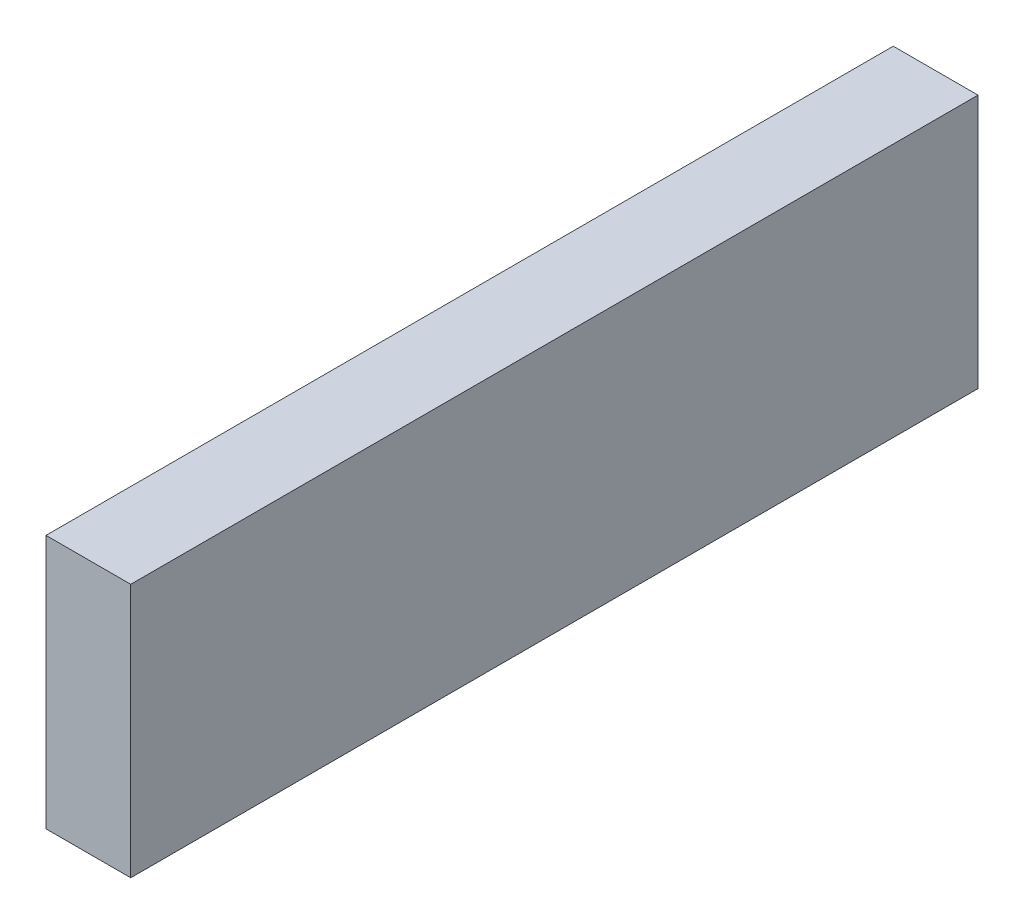
ISO-10303-21;
HEADER;
FILE_DESCRIPTION(('STEP AP214'),'2;1');
FILE_NAME('part.step','',(''),(''),'','','');
FILE_SCHEMA(('AUTOMOTIVE_DESIGN { 1 0 10303 214 1 1 1 1 }'));
ENDSEC;
DATA;
#1=APPLICATION_CONTEXT('core data for automotive mechanical design processes');
#2=APPLICATION_PROTOCOL_DEFINITION('international standard','automotive_design',2000,#1);
#3=PRODUCT_CONTEXT('',#1,'mechanical');
#4=PRODUCT('Part','Part','',(#3));
#5=PRODUCT_RELATED_PRODUCT_CATEGORY('part','',(#4));
#6=PRODUCT_DEFINITION_FORMATION('','',#4);
#7=PRODUCT_DEFINITION_CONTEXT('part definition',#1,'design');
#8=PRODUCT_DEFINITION('design','',#6,#7);
#9=PRODUCT_DEFINITION_SHAPE('','',#8);
#10=(LENGTH_UNIT() NAMED_UNIT(*) SI_UNIT(.MILLI.,.METRE.));
#11=(NAMED_UNIT(*) PLANE_ANGLE_UNIT() SI_UNIT($,.RADIAN.));
#12=(NAMED_UNIT(*) SI_UNIT($,.STERADIAN.) SOLID_ANGLE_UNIT());
#13=UNCERTAINTY_MEASURE_WITH_UNIT(LENGTH_MEASURE(1.E-05),#10,'distance_accuracy_value','');
#14=(GEOMETRIC_REPRESENTATION_CONTEXT(3) GLOBAL_UNCERTAINTY_ASSIGNED_CONTEXT((#13)) GLOBAL_UNIT_ASSIGNED_CONTEXT((#10,
#11,#12)) REPRESENTATION_CONTEXT('',''));
#15=CARTESIAN_POINT('',(0.,0.,0.));
#16=DIRECTION('',(0.,0.,1.));
#17=DIRECTION('',(1.,0.,0.));
#18=AXIS2_PLACEMENT_3D('',#15,#16,#17);
#19=CARTESIAN_POINT('',(0.,0.,508.));
#20=DIRECTION('',(-1.,0.,0.));
#21=DIRECTION('',(0.,0.,1.));
#22=AXIS2_PLACEMENT_3D('',#19,#20,#21);
#23=PLANE('',#22);
#24=DIRECTION('',(0.,1.,0.));
#25=VECTOR('',#24,1.);
#26=CARTESIAN_POINT('',(0.,0.,0.));
#27=LINE('',#26,#25);
#28=CARTESIAN_POINT('',(0.,0.,0.));
#29=VERTEX_POINT('',#28);
#30=CARTESIAN_POINT('',(0.,152.4,0.));
#31=VERTEX_POINT('',#30);
#32=EDGE_CURVE('E103',#29,#31,#27,.T.);
#33=ORIENTED_EDGE('',*,*,#32,.T.);
#34=DIRECTION('',(0.,0.,-1.));
#35=VECTOR('',#34,1.);
#36=CARTESIAN_POINT('',(0.,152.4,508.));
#37=LINE('',#36,#35);
#38=CARTESIAN_POINT('',(0.,152.4,508.));
#39=VERTEX_POINT('',#38);
#40=EDGE_CURVE('E11',#39,#31,#37,.T.);
#41=ORIENTED_EDGE('',*,*,#40,.F.);
#42=DIRECTION('',(0.,1.,0.));
#43=VECTOR('',#42,1.);
#44=CARTESIAN_POINT('',(0.,0.,508.));
#45=LINE('',#44,#43);
#46=CARTESIAN_POINT('',(0.,0.,508.));
#47=VERTEX_POINT('',#46);
#48=EDGE_CURVE('E86',#47,#39,#45,.T.);
#49=ORIENTED_EDGE('',*,*,#48,.F.);
#50=DIRECTION('',(0.,0.,-1.));
#51=VECTOR('',#50,1.);
#52=CARTESIAN_POINT('',(0.,0.,508.));
#53=LINE('',#52,#51);
#54=EDGE_CURVE('E99',#47,#29,#53,.T.);
#55=ORIENTED_EDGE('',*,*,#54,.T.);
#56=EDGE_LOOP('',(#33,#41,#49,#55));
#57=FACE_BOUND('',#56,.T.);
#58=ADVANCED_FACE('F34',(#57),#23,.F.);
#59=CARTESIAN_POINT('',(0.,152.4,508.));
#60=DIRECTION('',(0.,-1.,0.));
#61=DIRECTION('',(0.,0.,-1.));
#62=AXIS2_PLACEMENT_3D('',#59,#60,#61);
#63=PLANE('',#62);
#64=DIRECTION('',(-1.,0.,0.));
#65=VECTOR('',#64,1.);
#66=CARTESIAN_POINT('',(0.,152.4,0.));
#67=LINE('',#66,#65);
#68=CARTESIAN_POINT('',(-50.8,152.4,0.));
#69=VERTEX_POINT('',#68);
#70=EDGE_CURVE('E91',#31,#69,#67,.T.);
#71=ORIENTED_EDGE('',*,*,#70,.T.);
#72=DIRECTION('',(0.,0.,-1.));
#73=VECTOR('',#72,1.);
#74=CARTESIAN_POINT('',(-50.8,152.4,508.));
#75=LINE('',#74,#73);
#76=CARTESIAN_POINT('',(-50.8,152.4,508.));
#77=VERTEX_POINT('',#76);
#78=EDGE_CURVE('E43',#77,#69,#75,.T.);
#79=ORIENTED_EDGE('',*,*,#78,.F.);
#80=DIRECTION('',(-1.,0.,0.));
#81=VECTOR('',#80,1.);
#82=CARTESIAN_POINT('',(0.,152.4,508.));
#83=LINE('',#82,#81);
#84=EDGE_CURVE('E81',#39,#77,#83,.T.);
#85=ORIENTED_EDGE('',*,*,#84,.F.);
#86=ORIENTED_EDGE('',*,*,#40,.T.);
#87=EDGE_LOOP('',(#71,#79,#85,#86));
#88=FACE_BOUND('',#87,.T.);
#89=ADVANCED_FACE('F90',(#88),#63,.F.);
#90=CARTESIAN_POINT('',(-50.8,0.,508.));
#91=DIRECTION('',(1.,0.,0.));
#92=DIRECTION('',(0.,0.,-1.));
#93=AXIS2_PLACEMENT_3D('',#90,#91,#92);
#94=PLANE('',#93);
#95=DIRECTION('',(0.,-1.,0.));
#96=VECTOR('',#95,1.);
#97=CARTESIAN_POINT('',(-50.8,0.,0.));
#98=LINE('',#97,#96);
#99=CARTESIAN_POINT('',(-50.8,0.,0.));
#100=VERTEX_POINT('',#99);
#101=EDGE_CURVE('E68',#69,#100,#98,.T.);
#102=ORIENTED_EDGE('',*,*,#101,.T.);
#103=DIRECTION('',(0.,0.,-1.));
#104=VECTOR('',#103,1.);
#105=CARTESIAN_POINT('',(-50.8,0.,508.));
#106=LINE('',#105,#104);
#107=CARTESIAN_POINT('',(-50.8,0.,508.));
#108=VERTEX_POINT('',#107);
#109=EDGE_CURVE('E93',#108,#100,#106,.T.);
#110=ORIENTED_EDGE('',*,*,#109,.F.);
#111=DIRECTION('',(0.,-1.,0.));
#112=VECTOR('',#111,1.);
#113=CARTESIAN_POINT('',(-50.8,0.,508.));
#114=LINE('',#113,#112);
#115=EDGE_CURVE('E84',#77,#108,#114,.T.);
#116=ORIENTED_EDGE('',*,*,#115,.F.);
#117=ORIENTED_EDGE('',*,*,#78,.T.);
#118=EDGE_LOOP('',(#102,#110,#116,#117));
#119=FACE_BOUND('',#118,.T.);
#120=ADVANCED_FACE('F94',(#119),#94,.F.);
#121=CARTESIAN_POINT('',(0.,0.,508.));
#122=DIRECTION('',(0.,1.,0.));
#123=DIRECTION('',(0.,0.,1.));
#124=AXIS2_PLACEMENT_3D('',#121,#122,#123);
#125=PLANE('',#124);
#126=DIRECTION('',(1.,0.,0.));
#127=VECTOR('',#126,1.);
#128=CARTESIAN_POINT('',(0.,0.,0.));
#129=LINE('',#128,#127);
#130=EDGE_CURVE('E74',#100,#29,#129,.T.);
#131=ORIENTED_EDGE('',*,*,#130,.T.);
#132=ORIENTED_EDGE('',*,*,#54,.F.);
#133=DIRECTION('',(1.,0.,0.));
#134=VECTOR('',#133,1.);
#135=CARTESIAN_POINT('',(0.,0.,508.));
#136=LINE('',#135,#134);
#137=EDGE_CURVE('E51',#108,#47,#136,.T.);
#138=ORIENTED_EDGE('',*,*,#137,.F.);
#139=ORIENTED_EDGE('',*,*,#109,.T.);
#140=EDGE_LOOP('',(#131,#132,#138,#139));
#141=FACE_BOUND('',#140,.T.);
#142=ADVANCED_FACE('F117',(#141),#125,.F.);
#143=CARTESIAN_POINT('',(0.,0.,508.));
#144=DIRECTION('',(0.,0.,1.));
#145=DIRECTION('',(1.,0.,0.));
#146=AXIS2_PLACEMENT_3D('',#143,#144,#145);
#147=PLANE('',#146);
#148=ORIENTED_EDGE('',*,*,#48,.T.);
#149=ORIENTED_EDGE('',*,*,#84,.T.);
#150=ORIENTED_EDGE('',*,*,#115,.T.);
#151=ORIENTED_EDGE('',*,*,#137,.T.);
#152=EDGE_LOOP('',(#148,#149,#150,#151));
#153=FACE_BOUND('',#152,.T.);
#154=ADVANCED_FACE('F82',(#153),#147,.T.);
#155=CARTESIAN_POINT('',(0.,0.,0.));
#156=DIRECTION('',(0.,0.,1.));
#157=DIRECTION('',(1.,0.,0.));
#158=AXIS2_PLACEMENT_3D('',#155,#156,#157);
#159=PLANE('',#158);
#160=ORIENTED_EDGE('',*,*,#32,.F.);
#161=ORIENTED_EDGE('',*,*,#130,.F.);
#162=ORIENTED_EDGE('',*,*,#101,.F.);
#163=ORIENTED_EDGE('',*,*,#70,.F.);
#164=EDGE_LOOP('',(#160,#161,#162,#163));
#165=FACE_BOUND('',#164,.T.);
#166=ADVANCED_FACE('F120',(#165),#159,.F.);
#167=CLOSED_SHELL('',(#58,#89,#120,#142,#154,#166));
#168=MANIFOLD_SOLID_BREP('B2',#167);
#169=ADVANCED_BREP_SHAPE_REPRESENTATION('',(#18,#168),#14);
#170=SHAPE_DEFINITION_REPRESENTATION(#9,#169);
ENDSEC;
END-ISO-10303-21;
